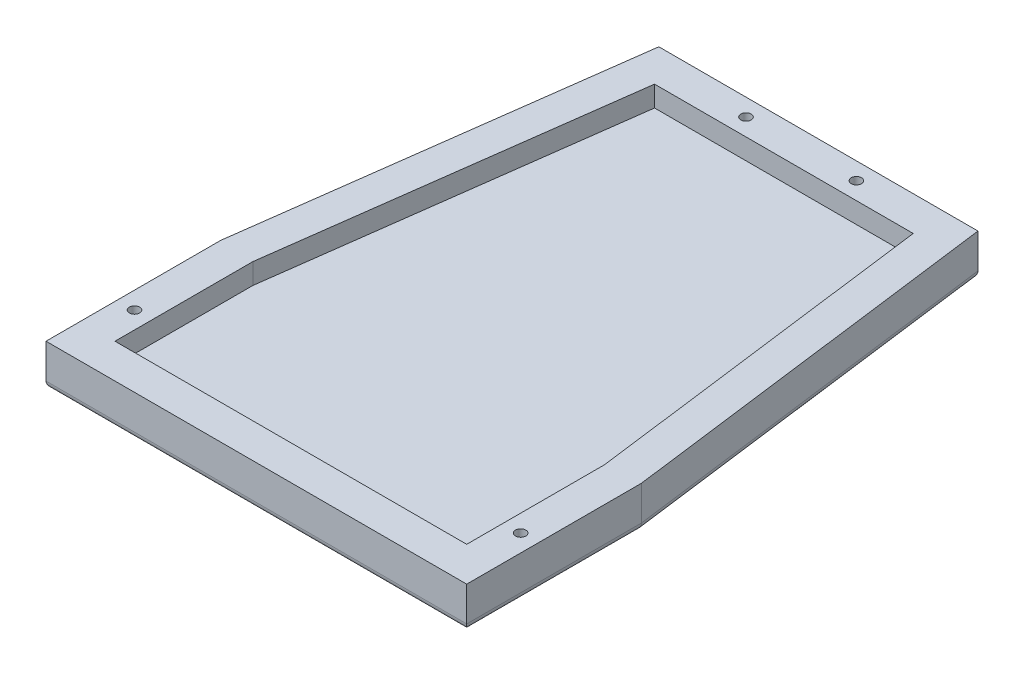
ISO-10303-21;
HEADER;
FILE_DESCRIPTION(('STEP AP214'),'2;1');
FILE_NAME('part.step','',(''),(''),'','','');
FILE_SCHEMA(('AUTOMOTIVE_DESIGN { 1 0 10303 214 1 1 1 1 }'));
ENDSEC;
DATA;
#1=APPLICATION_CONTEXT('core data for automotive mechanical design processes');
#2=APPLICATION_PROTOCOL_DEFINITION('international standard','automotive_design',2000,#1);
#3=PRODUCT_CONTEXT('',#1,'mechanical');
#4=PRODUCT('Part','Part','',(#3));
#5=PRODUCT_RELATED_PRODUCT_CATEGORY('part','',(#4));
#6=PRODUCT_DEFINITION_FORMATION('','',#4);
#7=PRODUCT_DEFINITION_CONTEXT('part definition',#1,'design');
#8=PRODUCT_DEFINITION('design','',#6,#7);
#9=PRODUCT_DEFINITION_SHAPE('','',#8);
#10=(LENGTH_UNIT() NAMED_UNIT(*) SI_UNIT(.MILLI.,.METRE.));
#11=(NAMED_UNIT(*) PLANE_ANGLE_UNIT() SI_UNIT($,.RADIAN.));
#12=(NAMED_UNIT(*) SI_UNIT($,.STERADIAN.) SOLID_ANGLE_UNIT());
#13=UNCERTAINTY_MEASURE_WITH_UNIT(LENGTH_MEASURE(1.E-05),#10,'distance_accuracy_value','');
#14=(GEOMETRIC_REPRESENTATION_CONTEXT(3) GLOBAL_UNCERTAINTY_ASSIGNED_CONTEXT((#13)) GLOBAL_UNIT_ASSIGNED_CONTEXT((#10,
#11,#12)) REPRESENTATION_CONTEXT('',''));
#15=CARTESIAN_POINT('',(0.,0.,0.));
#16=DIRECTION('',(0.,0.,1.));
#17=DIRECTION('',(1.,0.,0.));
#18=AXIS2_PLACEMENT_3D('',#15,#16,#17);
#19=CARTESIAN_POINT('',(-53.7251908396947,3.,36.412213740458));
#20=DIRECTION('',(1.,0.,0.));
#21=DIRECTION('',(0.,0.,-1.));
#22=AXIS2_PLACEMENT_3D('',#19,#20,#21);
#23=PLANE('',#22);
#24=DIRECTION('',(0.,-1.,0.));
#25=VECTOR('',#24,1.);
#26=CARTESIAN_POINT('',(-53.7251908396947,5.99999999999999,11.0812237718321));
#27=LINE('',#26,#25);
#28=CARTESIAN_POINT('',(-53.7251908396947,5.99999999999999,11.0812237718321));
#29=VERTEX_POINT('',#28);
#30=CARTESIAN_POINT('',(-53.7251908396947,1.,11.0812237718321));
#31=VERTEX_POINT('',#30);
#32=EDGE_CURVE('E290',#29,#31,#27,.T.);
#33=ORIENTED_EDGE('',*,*,#32,.T.);
#34=DIRECTION('',(0.,0.,1.));
#35=VECTOR('',#34,1.);
#36=CARTESIAN_POINT('',(-53.7251908396947,1.,36.412213740458));
#37=LINE('',#36,#35);
#38=CARTESIAN_POINT('',(-53.7251908396947,1.,36.412213740458));
#39=VERTEX_POINT('',#38);
#40=EDGE_CURVE('E364',#31,#39,#37,.T.);
#41=ORIENTED_EDGE('',*,*,#40,.T.);
#42=DIRECTION('',(0.,-1.,0.));
#43=VECTOR('',#42,1.);
#44=CARTESIAN_POINT('',(-53.7251908396947,3.,36.412213740458));
#45=LINE('',#44,#43);
#46=CARTESIAN_POINT('',(-53.7251908396947,5.99999999999999,36.412213740458));
#47=VERTEX_POINT('',#46);
#48=EDGE_CURVE('E311',#47,#39,#45,.T.);
#49=ORIENTED_EDGE('',*,*,#48,.F.);
#50=DIRECTION('',(0.,0.,-1.));
#51=VECTOR('',#50,1.);
#52=CARTESIAN_POINT('',(-53.7251908396947,5.99999999999999,31.412213740458));
#53=LINE('',#52,#51);
#54=EDGE_CURVE('E280',#47,#29,#53,.T.);
#55=ORIENTED_EDGE('',*,*,#54,.T.);
#56=EDGE_LOOP('',(#33,#41,#49,#55));
#57=FACE_BOUND('',#56,.T.);
#58=ADVANCED_FACE('F73',(#57),#23,.F.);
#59=CARTESIAN_POINT('',(7.27480916030533,3.,36.412213740458));
#60=DIRECTION('',(0.,0.,-1.));
#61=DIRECTION('',(-1.,0.,0.));
#62=AXIS2_PLACEMENT_3D('',#59,#60,#61);
#63=PLANE('',#62);
#64=ORIENTED_EDGE('',*,*,#48,.T.);
#65=DIRECTION('',(1.,0.,0.));
#66=VECTOR('',#65,1.);
#67=CARTESIAN_POINT('',(7.27480916030533,1.,36.412213740458));
#68=LINE('',#67,#66);
#69=CARTESIAN_POINT('',(7.27480916030533,1.,36.412213740458));
#70=VERTEX_POINT('',#69);
#71=EDGE_CURVE('E314',#39,#70,#68,.T.);
#72=ORIENTED_EDGE('',*,*,#71,.T.);
#73=DIRECTION('',(0.,-1.,0.));
#74=VECTOR('',#73,1.);
#75=CARTESIAN_POINT('',(7.27480916030533,3.,36.412213740458));
#76=LINE('',#75,#74);
#77=CARTESIAN_POINT('',(7.27480916030533,5.99999999999999,36.412213740458));
#78=VERTEX_POINT('',#77);
#79=EDGE_CURVE('E308',#78,#70,#76,.T.);
#80=ORIENTED_EDGE('',*,*,#79,.F.);
#81=DIRECTION('',(1.,0.,0.));
#82=VECTOR('',#81,1.);
#83=CARTESIAN_POINT('',(-48.7251908396947,5.99999999999999,36.412213740458));
#84=LINE('',#83,#82);
#85=EDGE_CURVE('E277',#47,#78,#84,.T.);
#86=ORIENTED_EDGE('',*,*,#85,.F.);
#87=EDGE_LOOP('',(#64,#72,#80,#86));
#88=FACE_BOUND('',#87,.T.);
#89=ADVANCED_FACE('F451',(#88),#63,.F.);
#90=CARTESIAN_POINT('',(7.27480916030533,3.,12.8854961832061));
#91=DIRECTION('',(-1.,0.,0.));
#92=DIRECTION('',(0.,0.,1.));
#93=AXIS2_PLACEMENT_3D('',#90,#91,#92);
#94=PLANE('',#93);
#95=ORIENTED_EDGE('',*,*,#79,.T.);
#96=DIRECTION('',(0.,0.,-1.));
#97=VECTOR('',#96,1.);
#98=CARTESIAN_POINT('',(7.27480916030533,1.,11.0895790229994));
#99=LINE('',#98,#97);
#100=CARTESIAN_POINT('',(7.27480916030533,1.,11.0895790229994));
#101=VERTEX_POINT('',#100);
#102=EDGE_CURVE('E358',#70,#101,#99,.T.);
#103=ORIENTED_EDGE('',*,*,#102,.T.);
#104=DIRECTION('',(0.,-1.,0.));
#105=VECTOR('',#104,1.);
#106=CARTESIAN_POINT('',(7.27480916030533,5.99999999999999,11.0895790229994));
#107=LINE('',#106,#105);
#108=CARTESIAN_POINT('',(7.27480916030533,5.99999999999999,11.0895790229994));
#109=VERTEX_POINT('',#108);
#110=EDGE_CURVE('E292',#109,#101,#107,.T.);
#111=ORIENTED_EDGE('',*,*,#110,.F.);
#112=DIRECTION('',(0.,0.,-1.));
#113=VECTOR('',#112,1.);
#114=CARTESIAN_POINT('',(7.27480916030533,5.99999999999999,31.412213740458));
#115=LINE('',#114,#113);
#116=EDGE_CURVE('E275',#78,#109,#115,.T.);
#117=ORIENTED_EDGE('',*,*,#116,.F.);
#118=EDGE_LOOP('',(#95,#103,#111,#117));
#119=FACE_BOUND('',#118,.T.);
#120=ADVANCED_FACE('F457',(#119),#94,.F.);
#121=CARTESIAN_POINT('',(-46.2251908396947,3.,-44.987786259542));
#122=DIRECTION('',(0.,0.,1.));
#123=DIRECTION('',(1.,0.,0.));
#124=AXIS2_PLACEMENT_3D('',#121,#122,#123);
#125=PLANE('',#124);
#126=DIRECTION('',(0.,-1.,0.));
#127=VECTOR('',#126,1.);
#128=CARTESIAN_POINT('',(0.00754831269221903,5.99999999999999,-44.987786259542));
#129=LINE('',#128,#127);
#130=CARTESIAN_POINT('',(0.00754831269221903,5.99999999999999,-44.987786259542));
#131=VERTEX_POINT('',#130);
#132=CARTESIAN_POINT('',(0.00754831269221903,1.,-44.987786259542));
#133=VERTEX_POINT('',#132);
#134=EDGE_CURVE('E286',#131,#133,#129,.T.);
#135=ORIENTED_EDGE('',*,*,#134,.T.);
#136=DIRECTION('',(-1.,0.,0.));
#137=VECTOR('',#136,1.);
#138=CARTESIAN_POINT('',(-46.2692054631826,1.,-44.987786259542));
#139=LINE('',#138,#137);
#140=CARTESIAN_POINT('',(-46.2692054631826,1.,-44.987786259542));
#141=VERTEX_POINT('',#140);
#142=EDGE_CURVE('E103',#133,#141,#139,.T.);
#143=ORIENTED_EDGE('',*,*,#142,.T.);
#144=DIRECTION('',(0.,-1.,0.));
#145=VECTOR('',#144,1.);
#146=CARTESIAN_POINT('',(-46.2692054631826,5.99999999999999,-44.987786259542));
#147=LINE('',#146,#145);
#148=CARTESIAN_POINT('',(-46.2692054631826,5.99999999999999,-44.987786259542));
#149=VERTEX_POINT('',#148);
#150=EDGE_CURVE('E287',#149,#141,#147,.T.);
#151=ORIENTED_EDGE('',*,*,#150,.F.);
#152=DIRECTION('',(1.,0.,0.));
#153=VECTOR('',#152,1.);
#154=CARTESIAN_POINT('',(-41.8900844567163,5.99999999999999,-44.987786259542));
#155=LINE('',#154,#153);
#156=EDGE_CURVE('E259',#149,#131,#155,.T.);
#157=ORIENTED_EDGE('',*,*,#156,.T.);
#158=EDGE_LOOP('',(#135,#143,#151,#157));
#159=FACE_BOUND('',#158,.T.);
#160=ADVANCED_FACE('F515',(#159),#125,.F.);
#161=CARTESIAN_POINT('',(0.,0.,0.));
#162=DIRECTION('',(0.,-1.,0.));
#163=DIRECTION('',(0.,0.,-1.));
#164=AXIS2_PLACEMENT_3D('',#161,#162,#163);
#165=PLANE('',#164);
#166=DIRECTION('',(0.128518769983283,0.,0.991707076591664));
#167=VECTOR('',#166,1.);
#168=CARTESIAN_POINT('',(4.74954369754596,0.,-0.615509890368357));
#169=LINE('',#168,#167);
#170=CARTESIAN_POINT('',(-0.871220479612719,0.,-43.987786259542));
#171=VERTEX_POINT('',#170);
#172=CARTESIAN_POINT('',(6.27480916030533,0.,11.1541059664911));
#173=VERTEX_POINT('',#172);
#174=EDGE_CURVE('E354',#171,#173,#169,.T.);
#175=ORIENTED_EDGE('',*,*,#174,.T.);
#176=DIRECTION('',(0.,0.,-1.));
#177=VECTOR('',#176,1.);
#178=CARTESIAN_POINT('',(6.27480916030533,0.,36.412213740458));
#179=LINE('',#178,#177);
#180=CARTESIAN_POINT('',(6.27480916030533,0.,25.1881912041334));
#181=VERTEX_POINT('',#180);
#182=EDGE_CURVE('E356',#173,#181,#179,.F.);
#183=ORIENTED_EDGE('',*,*,#182,.T.);
#184=CARTESIAN_POINT('',(4.77480916030533,0.,26.0895790229994));
#185=DIRECTION('',(0.,-1.,0.));
#186=DIRECTION('',(0.,0.,-1.));
#187=AXIS2_PLACEMENT_3D('',#184,#185,#186);
#188=CIRCLE('',#187,1.75);
#189=CARTESIAN_POINT('',(4.77480916030533,0.,24.3395790229994));
#190=VERTEX_POINT('',#189);
#191=EDGE_CURVE('E348',#181,#190,#188,.F.);
#192=ORIENTED_EDGE('',*,*,#191,.T.);
#193=CARTESIAN_POINT('',(4.77480916030533,0.,26.0895790229994));
#194=DIRECTION('',(0.,-1.,0.));
#195=DIRECTION('',(0.,0.,-1.));
#196=AXIS2_PLACEMENT_3D('',#193,#194,#195);
#197=CIRCLE('',#196,1.75);
#198=CARTESIAN_POINT('',(6.27480916030533,0.,26.9909668418654));
#199=VERTEX_POINT('',#198);
#200=EDGE_CURVE('E346',#190,#199,#197,.F.);
#201=ORIENTED_EDGE('',*,*,#200,.T.);
#202=DIRECTION('',(0.,0.,-1.));
#203=VECTOR('',#202,1.);
#204=CARTESIAN_POINT('',(6.27480916030533,0.,36.412213740458));
#205=LINE('',#204,#203);
#206=CARTESIAN_POINT('',(6.27480916030533,0.,35.412213740458));
#207=VERTEX_POINT('',#206);
#208=EDGE_CURVE('E344',#199,#207,#205,.F.);
#209=ORIENTED_EDGE('',*,*,#208,.T.);
#210=DIRECTION('',(1.,0.,0.));
#211=VECTOR('',#210,1.);
#212=CARTESIAN_POINT('',(-53.7251908396947,0.,35.412213740458));
#213=LINE('',#212,#211);
#214=CARTESIAN_POINT('',(-52.7251908396947,0.,35.412213740458));
#215=VERTEX_POINT('',#214);
#216=EDGE_CURVE('E337',#207,#215,#213,.F.);
#217=ORIENTED_EDGE('',*,*,#216,.T.);
#218=DIRECTION('',(0.,0.,1.));
#219=VECTOR('',#218,1.);
#220=CARTESIAN_POINT('',(-52.7251908396947,0.,11.0812237718321));
#221=LINE('',#220,#219);
#222=CARTESIAN_POINT('',(-52.7251908396947,0.,26.9826115906981));
#223=VERTEX_POINT('',#222);
#224=EDGE_CURVE('E331',#215,#223,#221,.F.);
#225=ORIENTED_EDGE('',*,*,#224,.T.);
#226=CARTESIAN_POINT('',(-51.2251908396947,0.,26.0812237718321));
#227=DIRECTION('',(0.,-1.,0.));
#228=DIRECTION('',(0.,0.,-1.));
#229=AXIS2_PLACEMENT_3D('',#226,#227,#228);
#230=CIRCLE('',#229,1.75);
#231=CARTESIAN_POINT('',(-51.2251908396947,0.,24.3312237718321));
#232=VERTEX_POINT('',#231);
#233=EDGE_CURVE('E327',#223,#232,#230,.F.);
#234=ORIENTED_EDGE('',*,*,#233,.T.);
#235=CARTESIAN_POINT('',(-51.2251908396947,0.,26.0812237718321));
#236=DIRECTION('',(0.,-1.,0.));
#237=DIRECTION('',(0.,0.,-1.));
#238=AXIS2_PLACEMENT_3D('',#235,#236,#237);
#239=CIRCLE('',#238,1.75);
#240=CARTESIAN_POINT('',(-52.7251908396947,0.,25.1798359529661));
#241=VERTEX_POINT('',#240);
#242=EDGE_CURVE('E325',#232,#241,#239,.F.);
#243=ORIENTED_EDGE('',*,*,#242,.T.);
#244=DIRECTION('',(0.,0.,1.));
#245=VECTOR('',#244,1.);
#246=CARTESIAN_POINT('',(-52.7251908396947,0.,11.0812237718321));
#247=LINE('',#246,#245);
#248=CARTESIAN_POINT('',(-52.7251908396947,0.,11.1474217655573));
#249=VERTEX_POINT('',#248);
#250=EDGE_CURVE('E329',#241,#249,#247,.F.);
#251=ORIENTED_EDGE('',*,*,#250,.T.);
#252=DIRECTION('',(0.131818336514164,0.,-0.991273890586572));
#253=VECTOR('',#252,1.);
#254=CARTESIAN_POINT('',(-50.352421883846,0.,-6.69580078242595));
#255=LINE('',#254,#253);
#256=CARTESIAN_POINT('',(-45.3933812618893,0.,-43.987786259542));
#257=VERTEX_POINT('',#256);
#258=EDGE_CURVE('E333',#249,#257,#255,.T.);
#259=ORIENTED_EDGE('',*,*,#258,.T.);
#260=DIRECTION('',(-1.,0.,0.));
#261=VECTOR('',#260,1.);
#262=CARTESIAN_POINT('',(0.00754831269222239,0.,-43.987786259542));
#263=LINE('',#262,#261);
#264=CARTESIAN_POINT('',(-32.0305932820486,0.,-43.987786259542));
#265=VERTEX_POINT('',#264);
#266=EDGE_CURVE('E335',#257,#265,#263,.F.);
#267=ORIENTED_EDGE('',*,*,#266,.T.);
#268=CARTESIAN_POINT('',(-31.1292054631826,0.,-42.487786259542));
#269=DIRECTION('',(0.,-1.,0.));
#270=DIRECTION('',(0.,0.,-1.));
#271=AXIS2_PLACEMENT_3D('',#268,#269,#270);
#272=CIRCLE('',#271,1.75);
#273=CARTESIAN_POINT('',(-30.2278176443166,0.,-43.987786259542));
#274=VERTEX_POINT('',#273);
#275=EDGE_CURVE('E340',#265,#274,#272,.F.);
#276=ORIENTED_EDGE('',*,*,#275,.T.);
#277=DIRECTION('',(-1.,0.,0.));
#278=VECTOR('',#277,1.);
#279=CARTESIAN_POINT('',(0.00754831269222239,0.,-43.987786259542));
#280=LINE('',#279,#278);
#281=CARTESIAN_POINT('',(-16.0305932820486,0.,-43.987786259542));
#282=VERTEX_POINT('',#281);
#283=EDGE_CURVE('E342',#274,#282,#280,.F.);
#284=ORIENTED_EDGE('',*,*,#283,.T.);
#285=CARTESIAN_POINT('',(-15.1292054631826,0.,-42.487786259542));
#286=DIRECTION('',(0.,-1.,0.));
#287=DIRECTION('',(0.,0.,-1.));
#288=AXIS2_PLACEMENT_3D('',#285,#286,#287);
#289=CIRCLE('',#288,1.75);
#290=CARTESIAN_POINT('',(-14.2278176443166,0.,-43.987786259542));
#291=VERTEX_POINT('',#290);
#292=EDGE_CURVE('E350',#282,#291,#289,.F.);
#293=ORIENTED_EDGE('',*,*,#292,.T.);
#294=DIRECTION('',(-1.,0.,0.));
#295=VECTOR('',#294,1.);
#296=CARTESIAN_POINT('',(0.00754831269222239,0.,-43.987786259542));
#297=LINE('',#296,#295);
#298=EDGE_CURVE('E352',#291,#171,#297,.F.);
#299=ORIENTED_EDGE('',*,*,#298,.T.);
#300=EDGE_LOOP('',(#175,#183,#192,#201,#209,#217,#225,#234,#243,#251,#259,#267,#276,#284,#293,#299));
#301=FACE_BOUND('',#300,.T.);
#302=ADVANCED_FACE('F476',(#301),#165,.T.);
#303=CARTESIAN_POINT('',(-41.8900844567163,5.99999999999999,-39.987786259542));
#304=DIRECTION('',(0.,0.,-1.));
#305=DIRECTION('',(-1.,0.,0.));
#306=AXIS2_PLACEMENT_3D('',#303,#304,#305);
#307=PLANE('',#306);
#308=DIRECTION('',(0.,-1.,0.));
#309=VECTOR('',#308,1.);
#310=CARTESIAN_POINT('',(-41.8900844567163,5.99999999999999,-39.987786259542));
#311=LINE('',#310,#309);
#312=CARTESIAN_POINT('',(-41.8900844567163,5.99999999999999,-39.987786259542));
#313=VERTEX_POINT('',#312);
#314=CARTESIAN_POINT('',(-41.8900844567163,3.,-39.987786259542));
#315=VERTEX_POINT('',#314);
#316=EDGE_CURVE('E257',#313,#315,#311,.T.);
#317=ORIENTED_EDGE('',*,*,#316,.T.);
#318=DIRECTION('',(1.,0.,0.));
#319=VECTOR('',#318,1.);
#320=CARTESIAN_POINT('',(0.,3.,-39.987786259542));
#321=LINE('',#320,#319);
#322=CARTESIAN_POINT('',(-4.38629564883247,3.,-39.987786259542));
#323=VERTEX_POINT('',#322);
#324=EDGE_CURVE('E226',#315,#323,#321,.T.);
#325=ORIENTED_EDGE('',*,*,#324,.T.);
#326=DIRECTION('',(0.,-1.,0.));
#327=VECTOR('',#326,1.);
#328=CARTESIAN_POINT('',(-4.38629564883247,5.99999999999999,-39.987786259542));
#329=LINE('',#328,#327);
#330=CARTESIAN_POINT('',(-4.38629564883247,5.99999999999999,-39.987786259542));
#331=VERTEX_POINT('',#330);
#332=EDGE_CURVE('E219',#331,#323,#329,.T.);
#333=ORIENTED_EDGE('',*,*,#332,.F.);
#334=DIRECTION('',(1.,0.,0.));
#335=VECTOR('',#334,1.);
#336=CARTESIAN_POINT('',(-41.8900844567163,5.99999999999999,-39.987786259542));
#337=LINE('',#336,#335);
#338=EDGE_CURVE('E224',#313,#331,#337,.T.);
#339=ORIENTED_EDGE('',*,*,#338,.F.);
#340=EDGE_LOOP('',(#317,#325,#333,#339));
#341=FACE_BOUND('',#340,.T.);
#342=ADVANCED_FACE('F222',(#341),#307,.F.);
#343=CARTESIAN_POINT('',(-48.7251908396947,5.99999999999999,11.412213740458));
#344=DIRECTION('',(-0.991273890586572,0.,-0.131818336514164));
#345=DIRECTION('',(-0.131818336514164,0.,0.991273890586572));
#346=AXIS2_PLACEMENT_3D('',#343,#344,#345);
#347=PLANE('',#346);
#348=DIRECTION('',(0.,-1.,0.));
#349=VECTOR('',#348,1.);
#350=CARTESIAN_POINT('',(-48.7251908396947,5.99999999999999,11.412213740458));
#351=LINE('',#350,#349);
#352=CARTESIAN_POINT('',(-48.7251908396947,5.99999999999999,11.412213740458));
#353=VERTEX_POINT('',#352);
#354=CARTESIAN_POINT('',(-48.7251908396947,3.,11.412213740458));
#355=VERTEX_POINT('',#354);
#356=EDGE_CURVE('E260',#353,#355,#351,.T.);
#357=ORIENTED_EDGE('',*,*,#356,.T.);
#358=DIRECTION('',(0.131818336514164,0.,-0.991273890586572));
#359=VECTOR('',#358,1.);
#360=CARTESIAN_POINT('',(-46.3873263214997,3.,-6.16852743636929));
#361=LINE('',#360,#359);
#362=EDGE_CURVE('E304',#355,#315,#361,.T.);
#363=ORIENTED_EDGE('',*,*,#362,.T.);
#364=ORIENTED_EDGE('',*,*,#316,.F.);
#365=DIRECTION('',(0.131818336514164,0.,-0.991273890586572));
#366=VECTOR('',#365,1.);
#367=CARTESIAN_POINT('',(-48.7251908396947,5.99999999999999,11.412213740458));
#368=LINE('',#367,#366);
#369=EDGE_CURVE('E230',#353,#313,#368,.T.);
#370=ORIENTED_EDGE('',*,*,#369,.F.);
#371=EDGE_LOOP('',(#357,#363,#364,#370));
#372=FACE_BOUND('',#371,.T.);
#373=ADVANCED_FACE('F556',(#372),#347,.F.);
#374=CARTESIAN_POINT('',(-48.7251908396947,5.99999999999999,31.412213740458));
#375=DIRECTION('',(-1.,0.,0.));
#376=DIRECTION('',(0.,0.,1.));
#377=AXIS2_PLACEMENT_3D('',#374,#375,#376);
#378=PLANE('',#377);
#379=DIRECTION('',(0.,-1.,0.));
#380=VECTOR('',#379,1.);
#381=CARTESIAN_POINT('',(-48.7251908396947,5.99999999999999,31.412213740458));
#382=LINE('',#381,#380);
#383=CARTESIAN_POINT('',(-48.7251908396947,5.99999999999999,31.412213740458));
#384=VERTEX_POINT('',#383);
#385=CARTESIAN_POINT('',(-48.7251908396947,3.,31.412213740458));
#386=VERTEX_POINT('',#385);
#387=EDGE_CURVE('E263',#384,#386,#382,.T.);
#388=ORIENTED_EDGE('',*,*,#387,.T.);
#389=DIRECTION('',(0.,0.,-1.));
#390=VECTOR('',#389,1.);
#391=CARTESIAN_POINT('',(-48.7251908396947,3.,0.));
#392=LINE('',#391,#390);
#393=EDGE_CURVE('E301',#386,#355,#392,.T.);
#394=ORIENTED_EDGE('',*,*,#393,.T.);
#395=ORIENTED_EDGE('',*,*,#356,.F.);
#396=DIRECTION('',(0.,0.,-1.));
#397=VECTOR('',#396,1.);
#398=CARTESIAN_POINT('',(-48.7251908396947,5.99999999999999,31.412213740458));
#399=LINE('',#398,#397);
#400=EDGE_CURVE('E254',#384,#353,#399,.T.);
#401=ORIENTED_EDGE('',*,*,#400,.F.);
#402=EDGE_LOOP('',(#388,#394,#395,#401));
#403=FACE_BOUND('',#402,.T.);
#404=ADVANCED_FACE('F562',(#403),#378,.F.);
#405=CARTESIAN_POINT('',(-48.7251908396947,5.99999999999999,31.412213740458));
#406=DIRECTION('',(0.,0.,-1.));
#407=DIRECTION('',(-1.,0.,0.));
#408=AXIS2_PLACEMENT_3D('',#405,#406,#407);
#409=PLANE('',#408);
#410=DIRECTION('',(1.,0.,0.));
#411=VECTOR('',#410,1.);
#412=CARTESIAN_POINT('',(0.,3.,31.412213740458));
#413=LINE('',#412,#411);
#414=CARTESIAN_POINT('',(2.27480916030533,3.,31.412213740458));
#415=VERTEX_POINT('',#414);
#416=EDGE_CURVE('E299',#386,#415,#413,.T.);
#417=ORIENTED_EDGE('',*,*,#416,.F.);
#418=ORIENTED_EDGE('',*,*,#387,.F.);
#419=DIRECTION('',(1.,0.,0.));
#420=VECTOR('',#419,1.);
#421=CARTESIAN_POINT('',(-48.7251908396947,5.99999999999999,31.412213740458));
#422=LINE('',#421,#420);
#423=CARTESIAN_POINT('',(2.27480916030533,5.99999999999999,31.412213740458));
#424=VERTEX_POINT('',#423);
#425=EDGE_CURVE('E252',#384,#424,#422,.T.);
#426=ORIENTED_EDGE('',*,*,#425,.T.);
#427=DIRECTION('',(0.,-1.,0.));
#428=VECTOR('',#427,1.);
#429=CARTESIAN_POINT('',(2.27480916030533,5.99999999999999,31.412213740458));
#430=LINE('',#429,#428);
#431=EDGE_CURVE('E266',#424,#415,#430,.T.);
#432=ORIENTED_EDGE('',*,*,#431,.T.);
#433=EDGE_LOOP('',(#417,#418,#426,#432));
#434=FACE_BOUND('',#433,.T.);
#435=ADVANCED_FACE('F570',(#434),#409,.T.);
#436=CARTESIAN_POINT('',(2.27480916030533,5.99999999999999,31.412213740458));
#437=DIRECTION('',(-1.,0.,0.));
#438=DIRECTION('',(0.,0.,1.));
#439=AXIS2_PLACEMENT_3D('',#436,#437,#438);
#440=PLANE('',#439);
#441=DIRECTION('',(0.,0.,-1.));
#442=VECTOR('',#441,1.);
#443=CARTESIAN_POINT('',(2.27480916030533,3.,0.));
#444=LINE('',#443,#442);
#445=CARTESIAN_POINT('',(2.27480916030533,3.,11.412213740458));
#446=VERTEX_POINT('',#445);
#447=EDGE_CURVE('E297',#415,#446,#444,.T.);
#448=ORIENTED_EDGE('',*,*,#447,.F.);
#449=ORIENTED_EDGE('',*,*,#431,.F.);
#450=DIRECTION('',(0.,0.,-1.));
#451=VECTOR('',#450,1.);
#452=CARTESIAN_POINT('',(2.27480916030533,5.99999999999999,31.412213740458));
#453=LINE('',#452,#451);
#454=CARTESIAN_POINT('',(2.27480916030533,5.99999999999999,11.412213740458));
#455=VERTEX_POINT('',#454);
#456=EDGE_CURVE('E239',#424,#455,#453,.T.);
#457=ORIENTED_EDGE('',*,*,#456,.T.);
#458=DIRECTION('',(0.,-1.,0.));
#459=VECTOR('',#458,1.);
#460=CARTESIAN_POINT('',(2.27480916030533,5.99999999999999,11.412213740458));
#461=LINE('',#460,#459);
#462=EDGE_CURVE('E229',#455,#446,#461,.T.);
#463=ORIENTED_EDGE('',*,*,#462,.T.);
#464=EDGE_LOOP('',(#448,#449,#457,#463));
#465=FACE_BOUND('',#464,.T.);
#466=ADVANCED_FACE('F524',(#465),#440,.T.);
#467=CARTESIAN_POINT('',(-4.38629564883247,5.99999999999999,-39.987786259542));
#468=DIRECTION('',(0.991707076591664,0.,-0.128518769983283));
#469=DIRECTION('',(-0.128518769983283,0.,-0.991707076591664));
#470=AXIS2_PLACEMENT_3D('',#467,#468,#469);
#471=PLANE('',#470);
#472=ORIENTED_EDGE('',*,*,#332,.T.);
#473=DIRECTION('',(0.128518769983283,0.,0.991707076591664));
#474=VECTOR('',#473,1.);
#475=CARTESIAN_POINT('',(0.782715391179307,3.,-0.101434810435227));
#476=LINE('',#475,#474);
#477=EDGE_CURVE('E289',#323,#446,#476,.T.);
#478=ORIENTED_EDGE('',*,*,#477,.T.);
#479=ORIENTED_EDGE('',*,*,#462,.F.);
#480=DIRECTION('',(0.128518769983283,0.,0.991707076591664));
#481=VECTOR('',#480,1.);
#482=CARTESIAN_POINT('',(-4.38629564883247,5.99999999999999,-39.987786259542));
#483=LINE('',#482,#481);
#484=EDGE_CURVE('E233',#331,#455,#483,.T.);
#485=ORIENTED_EDGE('',*,*,#484,.F.);
#486=EDGE_LOOP('',(#472,#478,#479,#485));
#487=FACE_BOUND('',#486,.T.);
#488=ADVANCED_FACE('F234',(#487),#471,.F.);
#489=CARTESIAN_POINT('',(-53.6815602926275,5.99999999999999,10.7531220578872));
#490=DIRECTION('',(-0.991273890586572,0.,-0.131818336514164));
#491=DIRECTION('',(-0.131818336514164,0.,0.991273890586572));
#492=AXIS2_PLACEMENT_3D('',#489,#490,#491);
#493=PLANE('',#492);
#494=ORIENTED_EDGE('',*,*,#150,.T.);
#495=DIRECTION('',(0.131818336514164,0.,-0.991273890586572));
#496=VECTOR('',#495,1.);
#497=CARTESIAN_POINT('',(-53.6815602926275,1.,10.7531220578872));
#498=LINE('',#497,#496);
#499=EDGE_CURVE('E95',#141,#31,#498,.F.);
#500=ORIENTED_EDGE('',*,*,#499,.T.);
#501=ORIENTED_EDGE('',*,*,#32,.F.);
#502=DIRECTION('',(0.131818336514164,0.,-0.991273890586572));
#503=VECTOR('',#502,1.);
#504=CARTESIAN_POINT('',(-53.6815602926275,5.99999999999999,10.7531220578872));
#505=LINE('',#504,#503);
#506=EDGE_CURVE('E283',#29,#149,#505,.T.);
#507=ORIENTED_EDGE('',*,*,#506,.T.);
#508=EDGE_LOOP('',(#494,#500,#501,#507));
#509=FACE_BOUND('',#508,.T.);
#510=ADVANCED_FACE('F516',(#509),#493,.T.);
#511=CARTESIAN_POINT('',(0.572239734125846,5.99999999999999,-40.6303801094584));
#512=DIRECTION('',(0.991707076591664,0.,-0.128518769983283));
#513=DIRECTION('',(-0.128518769983283,0.,-0.991707076591664));
#514=AXIS2_PLACEMENT_3D('',#511,#512,#513);
#515=PLANE('',#514);
#516=ORIENTED_EDGE('',*,*,#110,.T.);
#517=DIRECTION('',(0.128518769983283,0.,0.991707076591664));
#518=VECTOR('',#517,1.);
#519=CARTESIAN_POINT('',(0.572239734125846,1.,-40.6303801094584));
#520=LINE('',#519,#518);
#521=EDGE_CURVE('E360',#101,#133,#520,.F.);
#522=ORIENTED_EDGE('',*,*,#521,.T.);
#523=ORIENTED_EDGE('',*,*,#134,.F.);
#524=DIRECTION('',(0.128518769983283,0.,0.991707076591664));
#525=VECTOR('',#524,1.);
#526=CARTESIAN_POINT('',(0.572239734125846,5.99999999999999,-40.6303801094584));
#527=LINE('',#526,#525);
#528=EDGE_CURVE('E272',#131,#109,#527,.T.);
#529=ORIENTED_EDGE('',*,*,#528,.T.);
#530=EDGE_LOOP('',(#516,#522,#523,#529));
#531=FACE_BOUND('',#530,.T.);
#532=ADVANCED_FACE('F514',(#531),#515,.T.);
#533=CARTESIAN_POINT('',(0.,5.99999999999999,0.));
#534=DIRECTION('',(0.,1.,0.));
#535=DIRECTION('',(0.,0.,1.));
#536=AXIS2_PLACEMENT_3D('',#533,#534,#535);
#537=PLANE('',#536);
#538=CARTESIAN_POINT('',(-51.2251908396947,5.99999999999998,26.0812237718321));
#539=DIRECTION('',(0.,1.,0.));
#540=DIRECTION('',(0.,0.,1.));
#541=AXIS2_PLACEMENT_3D('',#538,#539,#540);
#542=CIRCLE('',#541,0.749999999999999);
#543=CARTESIAN_POINT('',(-51.2251908396947,5.99999999999998,26.8312237718321));
#544=VERTEX_POINT('',#543);
#545=EDGE_CURVE('E245',#544,#544,#542,.F.);
#546=ORIENTED_EDGE('',*,*,#545,.T.);
#547=EDGE_LOOP('',(#546));
#548=FACE_BOUND('',#547,.T.);
#549=CARTESIAN_POINT('',(4.77480916030533,5.99999999999998,26.0895790229994));
#550=DIRECTION('',(0.,1.,0.));
#551=DIRECTION('',(0.,0.,1.));
#552=AXIS2_PLACEMENT_3D('',#549,#550,#551);
#553=CIRCLE('',#552,0.75);
#554=CARTESIAN_POINT('',(4.77480916030533,5.99999999999998,26.8395790229994));
#555=VERTEX_POINT('',#554);
#556=EDGE_CURVE('E248',#555,#555,#553,.F.);
#557=ORIENTED_EDGE('',*,*,#556,.T.);
#558=EDGE_LOOP('',(#557));
#559=FACE_BOUND('',#558,.T.);
#560=CARTESIAN_POINT('',(-15.1292054631826,5.99999999999998,-42.487786259542));
#561=DIRECTION('',(0.,1.,0.));
#562=DIRECTION('',(0.,0.,1.));
#563=AXIS2_PLACEMENT_3D('',#560,#561,#562);
#564=CIRCLE('',#563,0.75);
#565=CARTESIAN_POINT('',(-15.1292054631826,5.99999999999998,-41.737786259542));
#566=VERTEX_POINT('',#565);
#567=EDGE_CURVE('E318',#566,#566,#564,.F.);
#568=ORIENTED_EDGE('',*,*,#567,.T.);
#569=EDGE_LOOP('',(#568));
#570=FACE_BOUND('',#569,.T.);
#571=CARTESIAN_POINT('',(-31.1292054631826,5.99999999999998,-42.487786259542));
#572=DIRECTION('',(0.,1.,0.));
#573=DIRECTION('',(0.,0.,1.));
#574=AXIS2_PLACEMENT_3D('',#571,#572,#573);
#575=CIRCLE('',#574,0.749999999999999);
#576=CARTESIAN_POINT('',(-31.1292054631826,5.99999999999998,-41.737786259542));
#577=VERTEX_POINT('',#576);
#578=EDGE_CURVE('E315',#577,#577,#575,.F.);
#579=ORIENTED_EDGE('',*,*,#578,.T.);
#580=EDGE_LOOP('',(#579));
#581=FACE_BOUND('',#580,.T.);
#582=ORIENTED_EDGE('',*,*,#338,.T.);
#583=ORIENTED_EDGE('',*,*,#484,.T.);
#584=ORIENTED_EDGE('',*,*,#456,.F.);
#585=ORIENTED_EDGE('',*,*,#425,.F.);
#586=ORIENTED_EDGE('',*,*,#400,.T.);
#587=ORIENTED_EDGE('',*,*,#369,.T.);
#588=EDGE_LOOP('',(#582,#583,#584,#585,#586,#587));
#589=FACE_BOUND('',#588,.T.);
#590=ORIENTED_EDGE('',*,*,#156,.F.);
#591=ORIENTED_EDGE('',*,*,#506,.F.);
#592=ORIENTED_EDGE('',*,*,#54,.F.);
#593=ORIENTED_EDGE('',*,*,#85,.T.);
#594=ORIENTED_EDGE('',*,*,#116,.T.);
#595=ORIENTED_EDGE('',*,*,#528,.F.);
#596=EDGE_LOOP('',(#590,#591,#592,#593,#594,#595));
#597=FACE_BOUND('',#596,.T.);
#598=ADVANCED_FACE('F241',(#548,#559,#570,#581,#589,#597),#537,.T.);
#599=CARTESIAN_POINT('',(0.,3.,0.));
#600=DIRECTION('',(0.,-1.,0.));
#601=DIRECTION('',(0.,0.,-1.));
#602=AXIS2_PLACEMENT_3D('',#599,#600,#601);
#603=PLANE('',#602);
#604=ORIENTED_EDGE('',*,*,#324,.F.);
#605=ORIENTED_EDGE('',*,*,#362,.F.);
#606=ORIENTED_EDGE('',*,*,#393,.F.);
#607=ORIENTED_EDGE('',*,*,#416,.T.);
#608=ORIENTED_EDGE('',*,*,#447,.T.);
#609=ORIENTED_EDGE('',*,*,#477,.F.);
#610=EDGE_LOOP('',(#604,#605,#606,#607,#608,#609));
#611=FACE_BOUND('',#610,.T.);
#612=ADVANCED_FACE('F529',(#611),#603,.F.);
#613=CARTESIAN_POINT('',(-31.1292054631826,57.,-42.487786259542));
#614=DIRECTION('',(0.,-1.,0.));
#615=DIRECTION('',(0.,0.,-1.));
#616=AXIS2_PLACEMENT_3D('',#613,#614,#615);
#617=CYLINDRICAL_SURFACE('',#616,0.749999999999999);
#618=CARTESIAN_POINT('',(-31.1292054631826,1.,-42.487786259542));
#619=DIRECTION('',(0.,-1.,0.));
#620=DIRECTION('',(0.,0.,-1.));
#621=AXIS2_PLACEMENT_3D('',#618,#619,#620);
#622=CIRCLE('',#621,0.749999999999999);
#623=CARTESIAN_POINT('',(-31.1292054631826,1.,-43.237786259542));
#624=VERTEX_POINT('',#623);
#625=EDGE_CURVE('E366',#624,#624,#622,.T.);
#626=ORIENTED_EDGE('',*,*,#625,.T.);
#627=EDGE_LOOP('',(#626));
#628=FACE_BOUND('',#627,.T.);
#629=ORIENTED_EDGE('',*,*,#578,.F.);
#630=EDGE_LOOP('',(#629));
#631=FACE_BOUND('',#630,.T.);
#632=ADVANCED_FACE('F532',(#628,#631),#617,.F.);
#633=CARTESIAN_POINT('',(-15.1292054631826,57.,-42.487786259542));
#634=DIRECTION('',(0.,-1.,0.));
#635=DIRECTION('',(0.,0.,-1.));
#636=AXIS2_PLACEMENT_3D('',#633,#634,#635);
#637=CYLINDRICAL_SURFACE('',#636,0.75);
#638=CARTESIAN_POINT('',(-15.1292054631826,1.,-42.487786259542));
#639=DIRECTION('',(0.,-1.,0.));
#640=DIRECTION('',(0.,0.,-1.));
#641=AXIS2_PLACEMENT_3D('',#638,#639,#640);
#642=CIRCLE('',#641,0.75);
#643=CARTESIAN_POINT('',(-15.1292054631826,1.,-43.237786259542));
#644=VERTEX_POINT('',#643);
#645=EDGE_CURVE('E369',#644,#644,#642,.T.);
#646=ORIENTED_EDGE('',*,*,#645,.T.);
#647=EDGE_LOOP('',(#646));
#648=FACE_BOUND('',#647,.T.);
#649=ORIENTED_EDGE('',*,*,#567,.F.);
#650=EDGE_LOOP('',(#649));
#651=FACE_BOUND('',#650,.T.);
#652=ADVANCED_FACE('F660',(#648,#651),#637,.F.);
#653=CARTESIAN_POINT('',(4.77480916030533,57.,26.0895790229994));
#654=DIRECTION('',(0.,-1.,0.));
#655=DIRECTION('',(0.,0.,-1.));
#656=AXIS2_PLACEMENT_3D('',#653,#654,#655);
#657=CYLINDRICAL_SURFACE('',#656,0.75);
#658=CARTESIAN_POINT('',(4.77480916030533,1.,26.0895790229994));
#659=DIRECTION('',(0.,-1.,0.));
#660=DIRECTION('',(0.,0.,-1.));
#661=AXIS2_PLACEMENT_3D('',#658,#659,#660);
#662=CIRCLE('',#661,0.75);
#663=CARTESIAN_POINT('',(4.77480916030533,1.,25.3395790229994));
#664=VERTEX_POINT('',#663);
#665=EDGE_CURVE('E87',#664,#664,#662,.T.);
#666=ORIENTED_EDGE('',*,*,#665,.T.);
#667=EDGE_LOOP('',(#666));
#668=FACE_BOUND('',#667,.T.);
#669=ORIENTED_EDGE('',*,*,#556,.F.);
#670=EDGE_LOOP('',(#669));
#671=FACE_BOUND('',#670,.T.);
#672=ADVANCED_FACE('F445',(#668,#671),#657,.F.);
#673=CARTESIAN_POINT('',(-51.2251908396947,57.,26.0812237718321));
#674=DIRECTION('',(0.,-1.,0.));
#675=DIRECTION('',(0.,0.,-1.));
#676=AXIS2_PLACEMENT_3D('',#673,#674,#675);
#677=CYLINDRICAL_SURFACE('',#676,0.749999999999999);
#678=CARTESIAN_POINT('',(-51.2251908396947,1.,26.0812237718321));
#679=DIRECTION('',(0.,-1.,0.));
#680=DIRECTION('',(0.,0.,-1.));
#681=AXIS2_PLACEMENT_3D('',#678,#679,#680);
#682=CIRCLE('',#681,0.749999999999999);
#683=CARTESIAN_POINT('',(-51.2251908396947,1.,25.3312237718321));
#684=VERTEX_POINT('',#683);
#685=EDGE_CURVE('E12',#684,#684,#682,.T.);
#686=ORIENTED_EDGE('',*,*,#685,.T.);
#687=EDGE_LOOP('',(#686));
#688=FACE_BOUND('',#687,.T.);
#689=ORIENTED_EDGE('',*,*,#545,.F.);
#690=EDGE_LOOP('',(#689));
#691=FACE_BOUND('',#690,.T.);
#692=ADVANCED_FACE('F440',(#688,#691),#677,.F.);
#693=CARTESIAN_POINT('',(-31.1292054631826,1.,-42.487786259542));
#694=DIRECTION('',(0.,-1.,0.));
#695=DIRECTION('',(0.,0.,-1.));
#696=AXIS2_PLACEMENT_3D('',#693,#694,#695);
#697=TOROIDAL_SURFACE('',#696,1.75,1.);
#698=ORIENTED_EDGE('',*,*,#625,.F.);
#699=EDGE_LOOP('',(#698));
#700=FACE_BOUND('',#699,.T.);
#701=CARTESIAN_POINT('',(-30.2278176443166,0.,-43.987786259542));
#702=CARTESIAN_POINT('',(-30.2306482101453,1.34136744296955E-08,-43.9885713258643));
#703=CARTESIAN_POINT('',(-30.2334797732174,9.37089697981907E-07,-43.9893529617576));
#704=CARTESIAN_POINT('',(-30.3275103813716,6.10953237194104E-05,-44.0151863186321));
#705=CARTESIAN_POINT('',(-30.4197328053938,0.001040483799229,-44.0366763597203));
#706=CARTESIAN_POINT('',(-30.6056849308835,0.00339039700447985,-44.0719521454474));
#707=CARTESIAN_POINT('',(-30.6994156105667,0.00476118610070238,-44.0857326641081));
#708=CARTESIAN_POINT('',(-30.887862989578,0.00686678075470359,-44.1051922706658));
#709=CARTESIAN_POINT('',(-30.9825808397038,0.00760073351768762,-44.1108605018782));
#710=CARTESIAN_POINT('',(-31.1721049319401,0.00798168936130215,-44.1138844088787));
#711=CARTESIAN_POINT('',(-31.2669111127521,0.00762919596429377,-44.1112439353922));
#712=CARTESIAN_POINT('',(-31.473150125494,0.00589230299709584,-44.0965060784127));
#713=CARTESIAN_POINT('',(-31.5844652725763,0.00433160212129964,-44.0827733984408));
#714=CARTESIAN_POINT('',(-31.8050321736474,0.0014213927511232,-44.04438706704));
#715=CARTESIAN_POINT('',(-31.9142868854512,7.155741391977E-05,-44.0197505484977));
#716=CARTESIAN_POINT('',(-32.0249311610398,9.41469089386706E-07,-43.989352962184));
#717=CARTESIAN_POINT('',(-32.0277627241204,1.79279867467448E-08,-43.9885713263423));
#718=CARTESIAN_POINT('',(-32.0305932820486,0.,-43.987786259542));
#719=B_SPLINE_CURVE_WITH_KNOTS('',3,(#701,#702,#703,#704,#705,#706,#707,#708,#709,#710,#711,
#712,#713,#714,#715,#716,#717,#718),.UNSPECIFIED.,.F.,.F.,(4,2,2,2,2,2,2,2,4),(0.,
0.00881238613939136,0.29253981713978,0.576459343343552,0.86075848523341,1.14492588617583,
1.48086533775027,1.81627880104497,1.82509118718437),.UNSPECIFIED.);
#720=EDGE_CURVE('E77',#274,#265,#719,.T.);
#721=ORIENTED_EDGE('',*,*,#720,.F.);
#722=ORIENTED_EDGE('',*,*,#275,.F.);
#723=EDGE_LOOP('',(#721,#722));
#724=FACE_BOUND('',#723,.T.);
#725=ADVANCED_FACE('F435',(#700,#724),#697,.T.);
#726=CARTESIAN_POINT('',(-15.1292054631826,1.,-42.487786259542));
#727=DIRECTION('',(0.,-1.,0.));
#728=DIRECTION('',(0.,0.,-1.));
#729=AXIS2_PLACEMENT_3D('',#726,#727,#728);
#730=TOROIDAL_SURFACE('',#729,1.75,1.);
#731=ORIENTED_EDGE('',*,*,#645,.F.);
#732=EDGE_LOOP('',(#731));
#733=FACE_BOUND('',#732,.T.);
#734=CARTESIAN_POINT('',(-14.2278176443166,0.,-43.987786259542));
#735=CARTESIAN_POINT('',(-14.2306482101453,1.34136745387672E-08,-43.9885713258643));
#736=CARTESIAN_POINT('',(-14.2334797732174,9.37089698090624E-07,-43.9893529617576));
#737=CARTESIAN_POINT('',(-14.3275103813716,6.10953237194902E-05,-44.0151863186321));
#738=CARTESIAN_POINT('',(-14.4197328053938,0.0010404837992285,-44.0366763597203));
#739=CARTESIAN_POINT('',(-14.6056849308834,0.00339039700447855,-44.0719521454474));
#740=CARTESIAN_POINT('',(-14.6994156105666,0.00476118610070085,-44.0857326641081));
#741=CARTESIAN_POINT('',(-14.8878629895778,0.00686678075470204,-44.1051922706658));
#742=CARTESIAN_POINT('',(-14.9825808397036,0.00760073351768632,-44.1108605018782));
#743=CARTESIAN_POINT('',(-15.1721049319398,0.00798168936130254,-44.1138844088787));
#744=CARTESIAN_POINT('',(-15.2669111127518,0.00762919596429557,-44.1112439353922));
#745=CARTESIAN_POINT('',(-15.4731501254937,0.0058923029970994,-44.0965060784127));
#746=CARTESIAN_POINT('',(-15.5844652725761,0.0043316021213025,-44.0827733984409));
#747=CARTESIAN_POINT('',(-15.8050321736473,0.00142139275112488,-44.04438706704));
#748=CARTESIAN_POINT('',(-15.9142868854511,7.15574139209804E-05,-44.0197505484976));
#749=CARTESIAN_POINT('',(-16.0249311610398,9.41469089502802E-07,-43.989352962184));
#750=CARTESIAN_POINT('',(-16.0277627241204,1.79279868344078E-08,-43.9885713263423));
#751=CARTESIAN_POINT('',(-16.0305932820486,0.,-43.987786259542));
#752=B_SPLINE_CURVE_WITH_KNOTS('',3,(#734,#735,#736,#737,#738,#739,#740,#741,#742,#743,#744,
#745,#746,#747,#748,#749,#750,#751),.UNSPECIFIED.,.F.,.F.,(4,2,2,2,2,2,2,2,4),(0.,
0.00881238613939303,0.292539817139706,0.576459343343407,0.860758485233174,1.1449258861755,
1.4808653377501,1.81627880104498,1.82509118718437),.UNSPECIFIED.);
#753=EDGE_CURVE('E422',#291,#282,#752,.T.);
#754=ORIENTED_EDGE('',*,*,#753,.F.);
#755=ORIENTED_EDGE('',*,*,#292,.F.);
#756=EDGE_LOOP('',(#754,#755));
#757=FACE_BOUND('',#756,.T.);
#758=ADVANCED_FACE('F432',(#733,#757),#730,.T.);
#759=CARTESIAN_POINT('',(-46.2251908396947,1.,-43.987786259542));
#760=DIRECTION('',(1.,0.,0.));
#761=DIRECTION('',(0.,0.,-1.));
#762=AXIS2_PLACEMENT_3D('',#759,#760,#761);
#763=CYLINDRICAL_SURFACE('',#762,1.);
#764=ORIENTED_EDGE('',*,*,#720,.T.);
#765=ORIENTED_EDGE('',*,*,#266,.F.);
#766=CARTESIAN_POINT('',(-45.3933812618893,1.,-43.987786259542));
#767=DIRECTION('',(0.752269345551899,0.,-0.658855698725387));
#768=DIRECTION('',(-0.658855698725387,0.,-0.752269345551899));
#769=AXIS2_PLACEMENT_3D('',#766,#767,#768);
#770=ELLIPSE('',#769,1.32931111165557,1.);
#771=EDGE_CURVE('E420',#141,#257,#770,.F.);
#772=ORIENTED_EDGE('',*,*,#771,.F.);
#773=ORIENTED_EDGE('',*,*,#142,.F.);
#774=CARTESIAN_POINT('',(-0.871220479612721,1.,-43.987786259542));
#775=DIRECTION('',(0.751172007593229,0.,0.660106517925977));
#776=DIRECTION('',(0.660106517925977,0.,-0.751172007593228));
#777=AXIS2_PLACEMENT_3D('',#774,#775,#776);
#778=ELLIPSE('',#777,1.33125301514366,1.);
#779=EDGE_CURVE('E416',#171,#133,#778,.T.);
#780=ORIENTED_EDGE('',*,*,#779,.F.);
#781=ORIENTED_EDGE('',*,*,#298,.F.);
#782=ORIENTED_EDGE('',*,*,#753,.T.);
#783=ORIENTED_EDGE('',*,*,#283,.F.);
#784=EDGE_LOOP('',(#764,#765,#772,#773,#780,#781,#782,#783));
#785=FACE_BOUND('',#784,.T.);
#786=ADVANCED_FACE('F75',(#785),#763,.T.);
#787=CARTESIAN_POINT('',(-51.2251908396947,1.,26.0812237718321));
#788=DIRECTION('',(0.,-1.,0.));
#789=DIRECTION('',(0.,0.,-1.));
#790=AXIS2_PLACEMENT_3D('',#787,#788,#789);
#791=TOROIDAL_SURFACE('',#790,1.75,1.);
#792=ORIENTED_EDGE('',*,*,#685,.F.);
#793=EDGE_LOOP('',(#792));
#794=FACE_BOUND('',#793,.T.);
#795=ORIENTED_EDGE('',*,*,#242,.F.);
#796=ORIENTED_EDGE('',*,*,#233,.F.);
#797=CARTESIAN_POINT('',(-52.7251908396947,0.,25.1798359529661));
#798=CARTESIAN_POINT('',(-52.725975906017,1.34136744880327E-08,25.1826665187948));
#799=CARTESIAN_POINT('',(-52.7267575419103,9.37089698074384E-07,25.185498081867));
#800=CARTESIAN_POINT('',(-52.7525908987848,6.1095323720576E-05,25.2795286900211));
#801=CARTESIAN_POINT('',(-52.774080939873,0.00104048379922933,25.3717511140434));
#802=CARTESIAN_POINT('',(-52.8093567256001,0.00339039700447995,25.5577032395331));
#803=CARTESIAN_POINT('',(-52.8231372442608,0.00476118610070308,25.6514339192163));
#804=CARTESIAN_POINT('',(-52.8425968508185,0.00686678075470433,25.8398812982276));
#805=CARTESIAN_POINT('',(-52.8482650820309,0.00760073351768796,25.9345991483534));
#806=CARTESIAN_POINT('',(-52.8512889890314,0.00798168936130216,26.1241232405897));
#807=CARTESIAN_POINT('',(-52.8486485155449,0.00762919596429374,26.2189294214016));
#808=CARTESIAN_POINT('',(-52.8339106585654,0.00589230299709605,26.4251684341435));
#809=CARTESIAN_POINT('',(-52.8201779785936,0.00433160212130024,26.5364835812259));
#810=CARTESIAN_POINT('',(-52.7817916471926,0.00142139275112314,26.7570504822969));
#811=CARTESIAN_POINT('',(-52.75715512865,7.1557413918719E-05,26.8663051941006));
#812=CARTESIAN_POINT('',(-52.7267575423366,9.41469089420688E-07,26.9769494696893));
#813=CARTESIAN_POINT('',(-52.725975906495,1.79279868099041E-08,26.97978103277));
#814=CARTESIAN_POINT('',(-52.7251908396947,0.,26.9826115906981));
#815=B_SPLINE_CURVE_WITH_KNOTS('',3,(#797,#798,#799,#800,#801,#802,#803,#804,#805,#806,#807,
#808,#809,#810,#811,#812,#813,#814),.UNSPECIFIED.,.F.,.F.,(4,2,2,2,2,2,2,2,4),(0.,
0.00881238613939136,0.292539817139812,0.576459343343618,0.860758485233434,1.14492588617583,
1.48086533775023,1.81627880104498,1.82509118718436),.UNSPECIFIED.);
#816=EDGE_CURVE('E409',#241,#223,#815,.T.);
#817=ORIENTED_EDGE('',*,*,#816,.F.);
#818=EDGE_LOOP('',(#795,#796,#817));
#819=FACE_BOUND('',#818,.T.);
#820=ADVANCED_FACE('F405',(#794,#819),#791,.T.);
#821=CARTESIAN_POINT('',(-50.352421883846,1.,-6.69580078242595));
#822=DIRECTION('',(0.131818336514164,0.,-0.991273890586572));
#823=DIRECTION('',(-0.991273890586572,0.,-0.131818336514164));
#824=AXIS2_PLACEMENT_3D('',#821,#822,#823);
#825=CYLINDRICAL_SURFACE('',#824,1.);
#826=ORIENTED_EDGE('',*,*,#771,.T.);
#827=ORIENTED_EDGE('',*,*,#258,.F.);
#828=CARTESIAN_POINT('',(-52.7251908396947,1.,11.1474217655579));
#829=DIRECTION('',(0.0660534231263918,0.,-0.997816087910636));
#830=DIRECTION('',(-0.997816087910636,0.,-0.0660534231263911));
#831=AXIS2_PLACEMENT_3D('',#828,#829,#830);
#832=ELLIPSE('',#831,1.00218869200028,1.);
#833=EDGE_CURVE('E417',#31,#249,#832,.F.);
#834=ORIENTED_EDGE('',*,*,#833,.F.);
#835=ORIENTED_EDGE('',*,*,#499,.F.);
#836=EDGE_LOOP('',(#826,#827,#834,#835));
#837=FACE_BOUND('',#836,.T.);
#838=ADVANCED_FACE('F496',(#837),#825,.T.);
#839=CARTESIAN_POINT('',(4.74954369754596,1.,-0.615509890368357));
#840=DIRECTION('',(0.128518769983283,0.,0.991707076591664));
#841=DIRECTION('',(0.991707076591664,0.,-0.128518769983283));
#842=AXIS2_PLACEMENT_3D('',#839,#840,#841);
#843=CYLINDRICAL_SURFACE('',#842,1.);
#844=ORIENTED_EDGE('',*,*,#779,.T.);
#845=ORIENTED_EDGE('',*,*,#521,.F.);
#846=CARTESIAN_POINT('',(6.27480916030533,1.,11.1541059664912));
#847=DIRECTION('',(0.0643930252757868,0.,0.997924615537583));
#848=DIRECTION('',(0.997924615537583,0.,-0.0643930252757867));
#849=AXIS2_PLACEMENT_3D('',#846,#847,#848);
#850=ELLIPSE('',#849,1.00207970064081,1.);
#851=EDGE_CURVE('E387',#173,#101,#850,.T.);
#852=ORIENTED_EDGE('',*,*,#851,.F.);
#853=ORIENTED_EDGE('',*,*,#174,.F.);
#854=EDGE_LOOP('',(#844,#845,#852,#853));
#855=FACE_BOUND('',#854,.T.);
#856=ADVANCED_FACE('F396',(#855),#843,.T.);
#857=CARTESIAN_POINT('',(4.77480916030533,1.,26.0895790229994));
#858=DIRECTION('',(0.,-1.,0.));
#859=DIRECTION('',(0.,0.,-1.));
#860=AXIS2_PLACEMENT_3D('',#857,#858,#859);
#861=TOROIDAL_SURFACE('',#860,1.75,1.);
#862=ORIENTED_EDGE('',*,*,#665,.F.);
#863=EDGE_LOOP('',(#862));
#864=FACE_BOUND('',#863,.T.);
#865=ORIENTED_EDGE('',*,*,#200,.F.);
#866=ORIENTED_EDGE('',*,*,#191,.F.);
#867=CARTESIAN_POINT('',(6.27480916030533,0.,26.9909668418654));
#868=CARTESIAN_POINT('',(6.27559422662763,1.34136745715702E-08,26.9881362760367));
#869=CARTESIAN_POINT('',(6.27637586252095,9.37089698157837E-07,26.9853047129646));
#870=CARTESIAN_POINT('',(6.30220921939536,6.10953237205465E-05,26.8912741048105));
#871=CARTESIAN_POINT('',(6.32369926048362,0.00104048379922571,26.7990516807885));
#872=CARTESIAN_POINT('',(6.35897504621063,0.00339039700447142,26.6130995552991));
#873=CARTESIAN_POINT('',(6.37275556487139,0.00476118610069321,26.519368875616));
#874=CARTESIAN_POINT('',(6.39221517142908,0.00686678075469266,26.3309214966051));
#875=CARTESIAN_POINT('',(6.39788340264149,0.00760073351767558,26.2362036464794));
#876=CARTESIAN_POINT('',(6.40090730964211,0.00798168936130889,26.0466795542434));
#877=CARTESIAN_POINT('',(6.39826683615562,0.00762919596432039,25.9518733734315));
#878=CARTESIAN_POINT('',(6.38352897917618,0.00589230299709366,25.7456343606895));
#879=CARTESIAN_POINT('',(6.36979629920428,0.00433160212123115,25.6343192136069));
#880=CARTESIAN_POINT('',(6.33140996780352,0.00142139275121446,25.4137523125351));
#881=CARTESIAN_POINT('',(6.30677344926138,7.15574142366141E-05,25.304497600731));
#882=CARTESIAN_POINT('',(6.27637586294733,9.41469081125058E-07,25.1938533251422));
#883=CARTESIAN_POINT('',(6.27559422710566,1.79279697877887E-08,25.1910217620616));
#884=CARTESIAN_POINT('',(6.27480916030533,0.,25.1881912041334));
#885=B_SPLINE_CURVE_WITH_KNOTS('',3,(#867,#868,#869,#870,#871,#872,#873,#874,#875,#876,#877,
#878,#879,#880,#881,#882,#883,#884),.UNSPECIFIED.,.F.,.F.,(4,2,2,2,2,2,2,2,4),(0.,
0.00881238613939066,0.292539817139325,0.576459343342635,0.860758485232065,1.14492588617405,
1.48086533774939,1.81627880104497,1.82509118718437),.UNSPECIFIED.);
#886=EDGE_CURVE('E378',#199,#181,#885,.T.);
#887=ORIENTED_EDGE('',*,*,#886,.F.);
#888=EDGE_LOOP('',(#865,#866,#887));
#889=FACE_BOUND('',#888,.T.);
#890=ADVANCED_FACE('F391',(#864,#889),#861,.T.);
#891=CARTESIAN_POINT('',(-52.7251908396947,1.,36.412213740458));
#892=DIRECTION('',(0.,0.,-1.));
#893=DIRECTION('',(-1.,0.,0.));
#894=AXIS2_PLACEMENT_3D('',#891,#892,#893);
#895=CYLINDRICAL_SURFACE('',#894,1.);
#896=ORIENTED_EDGE('',*,*,#816,.T.);
#897=ORIENTED_EDGE('',*,*,#224,.F.);
#898=CARTESIAN_POINT('',(-52.7251908396947,1.,35.412213740458));
#899=DIRECTION('',(-0.707106781186548,0.,-0.707106781186547));
#900=DIRECTION('',(0.707106781186547,0.,-0.707106781186548));
#901=AXIS2_PLACEMENT_3D('',#898,#899,#900);
#902=ELLIPSE('',#901,1.4142135623731,1.);
#903=EDGE_CURVE('E376',#39,#215,#902,.F.);
#904=ORIENTED_EDGE('',*,*,#903,.F.);
#905=ORIENTED_EDGE('',*,*,#40,.F.);
#906=ORIENTED_EDGE('',*,*,#833,.T.);
#907=ORIENTED_EDGE('',*,*,#250,.F.);
#908=EDGE_LOOP('',(#896,#897,#904,#905,#906,#907));
#909=FACE_BOUND('',#908,.T.);
#910=ADVANCED_FACE('F395',(#909),#895,.T.);
#911=CARTESIAN_POINT('',(6.27480916030533,1.,12.8854961832061));
#912=DIRECTION('',(0.,0.,1.));
#913=DIRECTION('',(1.,0.,0.));
#914=AXIS2_PLACEMENT_3D('',#911,#912,#913);
#915=CYLINDRICAL_SURFACE('',#914,1.);
#916=ORIENTED_EDGE('',*,*,#851,.T.);
#917=ORIENTED_EDGE('',*,*,#102,.F.);
#918=CARTESIAN_POINT('',(6.27480916030533,1.,35.412213740458));
#919=DIRECTION('',(-0.707106781186547,0.,0.707106781186548));
#920=DIRECTION('',(0.707106781186548,0.,0.707106781186547));
#921=AXIS2_PLACEMENT_3D('',#918,#919,#920);
#922=ELLIPSE('',#921,1.41421356237309,1.);
#923=EDGE_CURVE('E374',#207,#70,#922,.T.);
#924=ORIENTED_EDGE('',*,*,#923,.F.);
#925=ORIENTED_EDGE('',*,*,#208,.F.);
#926=ORIENTED_EDGE('',*,*,#886,.T.);
#927=ORIENTED_EDGE('',*,*,#182,.F.);
#928=EDGE_LOOP('',(#916,#917,#924,#925,#926,#927));
#929=FACE_BOUND('',#928,.T.);
#930=ADVANCED_FACE('F398',(#929),#915,.T.);
#931=CARTESIAN_POINT('',(7.27480916030533,1.,35.412213740458));
#932=DIRECTION('',(-1.,0.,0.));
#933=DIRECTION('',(0.,0.,1.));
#934=AXIS2_PLACEMENT_3D('',#931,#932,#933);
#935=CYLINDRICAL_SURFACE('',#934,1.);
#936=ORIENTED_EDGE('',*,*,#903,.T.);
#937=ORIENTED_EDGE('',*,*,#216,.F.);
#938=ORIENTED_EDGE('',*,*,#923,.T.);
#939=ORIENTED_EDGE('',*,*,#71,.F.);
#940=EDGE_LOOP('',(#936,#937,#938,#939));
#941=FACE_BOUND('',#940,.T.);
#942=ADVANCED_FACE('F401',(#941),#935,.T.);
#943=CLOSED_SHELL('',(#58,#89,#120,#160,#302,#342,#373,#404,#435,#466,#488,#510,#532,#598,#612,
#632,#652,#672,#692,#725,#758,#786,#820,#838,#856,#890,#910,#930,#942));
#944=MANIFOLD_SOLID_BREP('B2',#943);
#945=ADVANCED_BREP_SHAPE_REPRESENTATION('',(#18,#944),#14);
#946=SHAPE_DEFINITION_REPRESENTATION(#9,#945);
ENDSEC;
END-ISO-10303-21;
